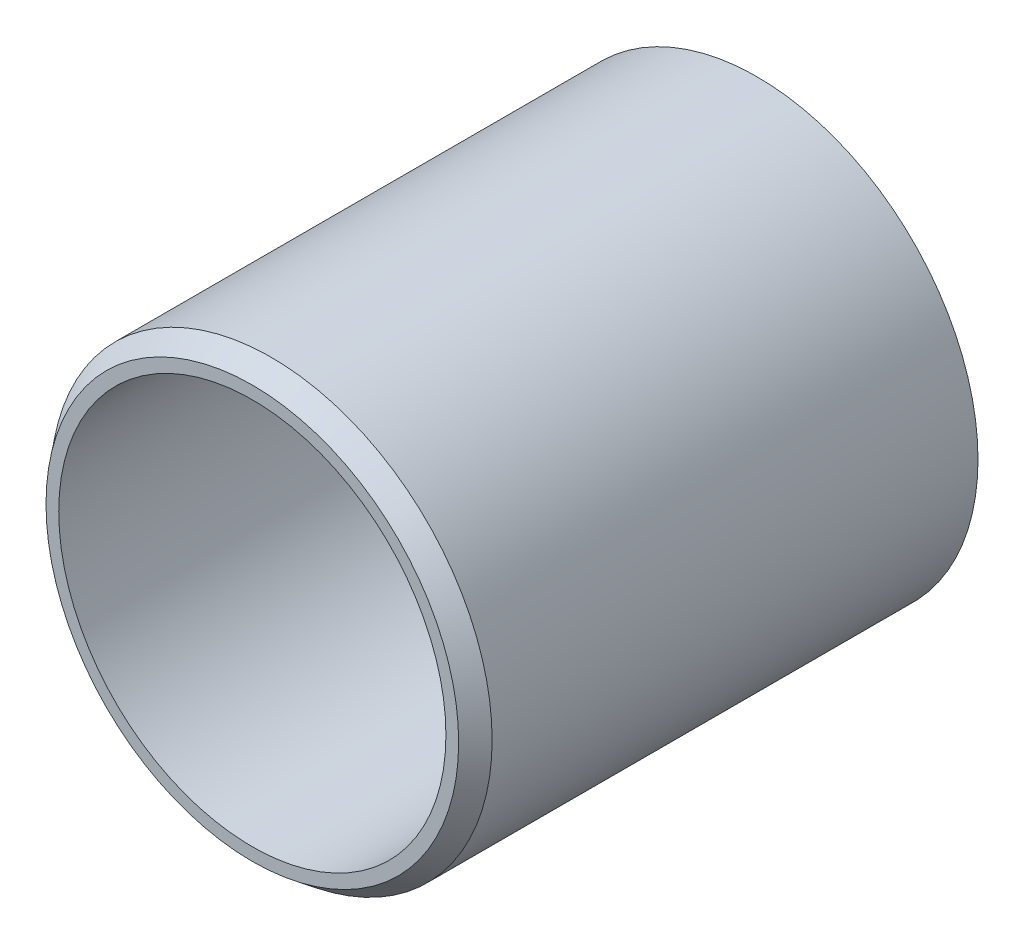
ISO-10303-21;
HEADER;
FILE_DESCRIPTION(('STEP AP214'),'2;1');
FILE_NAME('part.step','',(''),(''),'','','');
FILE_SCHEMA(('AUTOMOTIVE_DESIGN { 1 0 10303 214 1 1 1 1 }'));
ENDSEC;
DATA;
#1=APPLICATION_CONTEXT('core data for automotive mechanical design processes');
#2=APPLICATION_PROTOCOL_DEFINITION('international standard','automotive_design',2000,#1);
#3=PRODUCT_CONTEXT('',#1,'mechanical');
#4=PRODUCT('Part','Part','',(#3));
#5=PRODUCT_RELATED_PRODUCT_CATEGORY('part','',(#4));
#6=PRODUCT_DEFINITION_FORMATION('','',#4);
#7=PRODUCT_DEFINITION_CONTEXT('part definition',#1,'design');
#8=PRODUCT_DEFINITION('design','',#6,#7);
#9=PRODUCT_DEFINITION_SHAPE('','',#8);
#10=(LENGTH_UNIT() NAMED_UNIT(*) SI_UNIT(.MILLI.,.METRE.));
#11=(NAMED_UNIT(*) PLANE_ANGLE_UNIT() SI_UNIT($,.RADIAN.));
#12=(NAMED_UNIT(*) SI_UNIT($,.STERADIAN.) SOLID_ANGLE_UNIT());
#13=UNCERTAINTY_MEASURE_WITH_UNIT(LENGTH_MEASURE(1.E-05),#10,'distance_accuracy_value','');
#14=(GEOMETRIC_REPRESENTATION_CONTEXT(3) GLOBAL_UNCERTAINTY_ASSIGNED_CONTEXT((#13)) GLOBAL_UNIT_ASSIGNED_CONTEXT((#10,
#11,#12)) REPRESENTATION_CONTEXT('',''));
#15=CARTESIAN_POINT('',(0.,0.,0.));
#16=DIRECTION('',(0.,0.,1.));
#17=DIRECTION('',(1.,0.,0.));
#18=AXIS2_PLACEMENT_3D('',#15,#16,#17);
#19=CARTESIAN_POINT('',(0.,0.,50.8));
#20=DIRECTION('',(0.,0.,1.));
#21=DIRECTION('',(1.,0.,0.));
#22=AXIS2_PLACEMENT_3D('',#19,#20,#21);
#23=PLANE('',#22);
#24=CARTESIAN_POINT('',(0.,0.,50.8));
#25=DIRECTION('',(0.,0.,1.));
#26=DIRECTION('',(1.,0.,0.));
#27=AXIS2_PLACEMENT_3D('',#24,#25,#26);
#28=CIRCLE('',#27,41.5264841758001);
#29=CARTESIAN_POINT('',(41.5264841758001,0.,50.8));
#30=VERTEX_POINT('',#29);
#31=EDGE_CURVE('E45',#30,#30,#28,.T.);
#32=ORIENTED_EDGE('',*,*,#31,.T.);
#33=EDGE_LOOP('',(#32));
#34=FACE_BOUND('',#33,.T.);
#35=CARTESIAN_POINT('',(0.,0.,50.8));
#36=DIRECTION('',(0.,0.,1.));
#37=DIRECTION('',(1.,0.,0.));
#38=AXIS2_PLACEMENT_3D('',#35,#36,#37);
#39=CIRCLE('',#38,38.9636);
#40=CARTESIAN_POINT('',(38.9636,0.,50.8));
#41=VERTEX_POINT('',#40);
#42=EDGE_CURVE('E56',#41,#41,#39,.T.);
#43=ORIENTED_EDGE('',*,*,#42,.F.);
#44=EDGE_LOOP('',(#43));
#45=FACE_BOUND('',#44,.T.);
#46=ADVANCED_FACE('F37',(#34,#45),#23,.T.);
#47=CARTESIAN_POINT('',(0.,0.,-50.8));
#48=DIRECTION('',(0.,0.,1.));
#49=DIRECTION('',(1.,0.,0.));
#50=AXIS2_PLACEMENT_3D('',#47,#48,#49);
#51=PLANE('',#50);
#52=CARTESIAN_POINT('',(0.,0.,-50.8));
#53=DIRECTION('',(0.,0.,1.));
#54=DIRECTION('',(1.,0.,0.));
#55=AXIS2_PLACEMENT_3D('',#52,#53,#54);
#56=CIRCLE('',#55,44.45);
#57=CARTESIAN_POINT('',(44.45,0.,-50.8));
#58=VERTEX_POINT('',#57);
#59=EDGE_CURVE('E51',#58,#58,#56,.T.);
#60=ORIENTED_EDGE('',*,*,#59,.F.);
#61=EDGE_LOOP('',(#60));
#62=FACE_BOUND('',#61,.T.);
#63=CARTESIAN_POINT('',(0.,0.,-50.8));
#64=DIRECTION('',(0.,0.,1.));
#65=DIRECTION('',(1.,0.,0.));
#66=AXIS2_PLACEMENT_3D('',#63,#64,#65);
#67=CIRCLE('',#66,38.9636);
#68=CARTESIAN_POINT('',(38.9636,0.,-50.8));
#69=VERTEX_POINT('',#68);
#70=EDGE_CURVE('E59',#69,#69,#67,.T.);
#71=ORIENTED_EDGE('',*,*,#70,.T.);
#72=EDGE_LOOP('',(#71));
#73=FACE_BOUND('',#72,.T.);
#74=ADVANCED_FACE('F70',(#62,#73),#51,.F.);
#75=CARTESIAN_POINT('',(0.,0.,50.8));
#76=DIRECTION('',(0.,0.,-1.));
#77=DIRECTION('',(-1.,0.,0.));
#78=AXIS2_PLACEMENT_3D('',#75,#76,#77);
#79=CYLINDRICAL_SURFACE('',#78,44.45);
#80=CARTESIAN_POINT('',(0.,0.,46.9899999999999));
#81=DIRECTION('',(0.,0.,1.));
#82=DIRECTION('',(1.,0.,0.));
#83=AXIS2_PLACEMENT_3D('',#80,#81,#82);
#84=CIRCLE('',#83,44.45);
#85=CARTESIAN_POINT('',(44.45,0.,46.9899999999999));
#86=VERTEX_POINT('',#85);
#87=EDGE_CURVE('E10',#86,#86,#84,.F.);
#88=ORIENTED_EDGE('',*,*,#87,.T.);
#89=EDGE_LOOP('',(#88));
#90=FACE_BOUND('',#89,.T.);
#91=ORIENTED_EDGE('',*,*,#59,.T.);
#92=EDGE_LOOP('',(#91));
#93=FACE_BOUND('',#92,.T.);
#94=ADVANCED_FACE('F75',(#90,#93),#79,.T.);
#95=CARTESIAN_POINT('',(0.,0.,50.8));
#96=DIRECTION('',(0.,0.,-1.));
#97=DIRECTION('',(-1.,0.,0.));
#98=AXIS2_PLACEMENT_3D('',#95,#96,#97);
#99=CYLINDRICAL_SURFACE('',#98,38.9636);
#100=ORIENTED_EDGE('',*,*,#42,.T.);
#101=EDGE_LOOP('',(#100));
#102=FACE_BOUND('',#101,.T.);
#103=ORIENTED_EDGE('',*,*,#70,.F.);
#104=EDGE_LOOP('',(#103));
#105=FACE_BOUND('',#104,.T.);
#106=ADVANCED_FACE('F66',(#102,#105),#99,.F.);
#107=CARTESIAN_POINT('',(0.,0.,50.8));
#108=DIRECTION('',(0.,0.,-1.));
#109=DIRECTION('',(-1.,0.,0.));
#110=AXIS2_PLACEMENT_3D('',#107,#108,#109);
#111=CONICAL_SURFACE('',#110,41.5264841758001,0.654498469497875);
#112=ORIENTED_EDGE('',*,*,#87,.F.);
#113=EDGE_LOOP('',(#112));
#114=FACE_BOUND('',#113,.T.);
#115=ORIENTED_EDGE('',*,*,#31,.F.);
#116=EDGE_LOOP('',(#115));
#117=FACE_BOUND('',#116,.T.);
#118=ADVANCED_FACE('F39',(#114,#117),#111,.T.);
#119=CLOSED_SHELL('',(#46,#74,#94,#106,#118));
#120=MANIFOLD_SOLID_BREP('B2',#119);
#121=ADVANCED_BREP_SHAPE_REPRESENTATION('',(#18,#120),#14);
#122=SHAPE_DEFINITION_REPRESENTATION(#9,#121);
ENDSEC;
END-ISO-10303-21;
